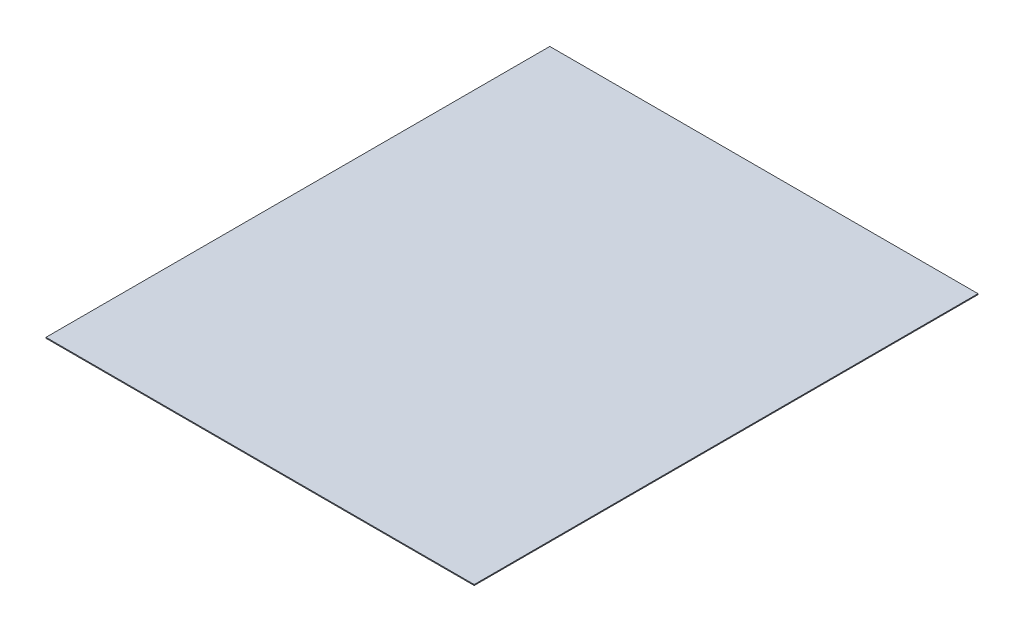
ISO-10303-21;
HEADER;
FILE_DESCRIPTION(('STEP AP214'),'2;1');
FILE_NAME('part.step','',(''),(''),'','','');
FILE_SCHEMA(('AUTOMOTIVE_DESIGN { 1 0 10303 214 1 1 1 1 }'));
ENDSEC;
DATA;
#1=APPLICATION_CONTEXT('core data for automotive mechanical design processes');
#2=APPLICATION_PROTOCOL_DEFINITION('international standard','automotive_design',2000,#1);
#3=PRODUCT_CONTEXT('',#1,'mechanical');
#4=PRODUCT('Part','Part','',(#3));
#5=PRODUCT_RELATED_PRODUCT_CATEGORY('part','',(#4));
#6=PRODUCT_DEFINITION_FORMATION('','',#4);
#7=PRODUCT_DEFINITION_CONTEXT('part definition',#1,'design');
#8=PRODUCT_DEFINITION('design','',#6,#7);
#9=PRODUCT_DEFINITION_SHAPE('','',#8);
#10=(LENGTH_UNIT() NAMED_UNIT(*) SI_UNIT(.MILLI.,.METRE.));
#11=(NAMED_UNIT(*) PLANE_ANGLE_UNIT() SI_UNIT($,.RADIAN.));
#12=(NAMED_UNIT(*) SI_UNIT($,.STERADIAN.) SOLID_ANGLE_UNIT());
#13=UNCERTAINTY_MEASURE_WITH_UNIT(LENGTH_MEASURE(1.E-05),#10,'distance_accuracy_value','');
#14=(GEOMETRIC_REPRESENTATION_CONTEXT(3) GLOBAL_UNCERTAINTY_ASSIGNED_CONTEXT((#13)) GLOBAL_UNIT_ASSIGNED_CONTEXT((#10,
#11,#12)) REPRESENTATION_CONTEXT('',''));
#15=CARTESIAN_POINT('',(0.,0.,0.));
#16=DIRECTION('',(0.,0.,1.));
#17=DIRECTION('',(1.,0.,0.));
#18=AXIS2_PLACEMENT_3D('',#15,#16,#17);
#19=CARTESIAN_POINT('',(1.5,1968.5,-820.));
#20=DIRECTION('',(-1.,0.,0.));
#21=DIRECTION('',(0.,0.,1.));
#22=AXIS2_PLACEMENT_3D('',#19,#20,#21);
#23=PLANE('',#22);
#24=DIRECTION('',(0.,-1.,0.));
#25=VECTOR('',#24,1.);
#26=CARTESIAN_POINT('',(1.5,1968.5,0.));
#27=LINE('',#26,#25);
#28=CARTESIAN_POINT('',(1.5,1970.,0.));
#29=VERTEX_POINT('',#28);
#30=CARTESIAN_POINT('',(1.5,1968.5,0.));
#31=VERTEX_POINT('',#30);
#32=EDGE_CURVE('E103',#29,#31,#27,.T.);
#33=ORIENTED_EDGE('',*,*,#32,.F.);
#34=DIRECTION('',(0.,0.,1.));
#35=VECTOR('',#34,1.);
#36=CARTESIAN_POINT('',(1.5,1970.,-820.));
#37=LINE('',#36,#35);
#38=CARTESIAN_POINT('',(1.5,1970.,-820.));
#39=VERTEX_POINT('',#38);
#40=EDGE_CURVE('E11',#39,#29,#37,.T.);
#41=ORIENTED_EDGE('',*,*,#40,.F.);
#42=DIRECTION('',(0.,-1.,0.));
#43=VECTOR('',#42,1.);
#44=CARTESIAN_POINT('',(1.5,1968.5,-820.));
#45=LINE('',#44,#43);
#46=CARTESIAN_POINT('',(1.5,1968.5,-820.));
#47=VERTEX_POINT('',#46);
#48=EDGE_CURVE('E97',#39,#47,#45,.T.);
#49=ORIENTED_EDGE('',*,*,#48,.T.);
#50=DIRECTION('',(0.,0.,1.));
#51=VECTOR('',#50,1.);
#52=CARTESIAN_POINT('',(1.5,1968.5,-820.));
#53=LINE('',#52,#51);
#54=EDGE_CURVE('E42',#47,#31,#53,.T.);
#55=ORIENTED_EDGE('',*,*,#54,.T.);
#56=EDGE_LOOP('',(#33,#41,#49,#55));
#57=FACE_BOUND('',#56,.T.);
#58=ADVANCED_FACE('F39',(#57),#23,.T.);
#59=CARTESIAN_POINT('',(1.5,1970.,-820.));
#60=DIRECTION('',(0.,1.,0.));
#61=DIRECTION('',(0.,0.,1.));
#62=AXIS2_PLACEMENT_3D('',#59,#60,#61);
#63=PLANE('',#62);
#64=DIRECTION('',(-1.,0.,0.));
#65=VECTOR('',#64,1.);
#66=CARTESIAN_POINT('',(1.5,1970.,0.));
#67=LINE('',#66,#65);
#68=CARTESIAN_POINT('',(698.5,1970.,0.));
#69=VERTEX_POINT('',#68);
#70=EDGE_CURVE('E99',#69,#29,#67,.T.);
#71=ORIENTED_EDGE('',*,*,#70,.F.);
#72=DIRECTION('',(0.,0.,1.));
#73=VECTOR('',#72,1.);
#74=CARTESIAN_POINT('',(698.5,1970.,-820.));
#75=LINE('',#74,#73);
#76=CARTESIAN_POINT('',(698.5,1970.,-820.));
#77=VERTEX_POINT('',#76);
#78=EDGE_CURVE('E48',#77,#69,#75,.T.);
#79=ORIENTED_EDGE('',*,*,#78,.F.);
#80=DIRECTION('',(-1.,0.,0.));
#81=VECTOR('',#80,1.);
#82=CARTESIAN_POINT('',(1.5,1970.,-820.));
#83=LINE('',#82,#81);
#84=EDGE_CURVE('E94',#77,#39,#83,.T.);
#85=ORIENTED_EDGE('',*,*,#84,.T.);
#86=ORIENTED_EDGE('',*,*,#40,.T.);
#87=EDGE_LOOP('',(#71,#79,#85,#86));
#88=FACE_BOUND('',#87,.T.);
#89=ADVANCED_FACE('F113',(#88),#63,.T.);
#90=CARTESIAN_POINT('',(698.5,1968.5,-820.));
#91=DIRECTION('',(1.,0.,0.));
#92=DIRECTION('',(0.,0.,-1.));
#93=AXIS2_PLACEMENT_3D('',#90,#91,#92);
#94=PLANE('',#93);
#95=DIRECTION('',(0.,1.,0.));
#96=VECTOR('',#95,1.);
#97=CARTESIAN_POINT('',(698.5,1968.5,0.));
#98=LINE('',#97,#96);
#99=CARTESIAN_POINT('',(698.5,1968.5,0.));
#100=VERTEX_POINT('',#99);
#101=EDGE_CURVE('E89',#100,#69,#98,.T.);
#102=ORIENTED_EDGE('',*,*,#101,.F.);
#103=DIRECTION('',(0.,0.,1.));
#104=VECTOR('',#103,1.);
#105=CARTESIAN_POINT('',(698.5,1968.5,-820.));
#106=LINE('',#105,#104);
#107=CARTESIAN_POINT('',(698.5,1968.5,-820.));
#108=VERTEX_POINT('',#107);
#109=EDGE_CURVE('E84',#108,#100,#106,.T.);
#110=ORIENTED_EDGE('',*,*,#109,.F.);
#111=DIRECTION('',(0.,1.,0.));
#112=VECTOR('',#111,1.);
#113=CARTESIAN_POINT('',(698.5,1968.5,-820.));
#114=LINE('',#113,#112);
#115=EDGE_CURVE('E87',#108,#77,#114,.T.);
#116=ORIENTED_EDGE('',*,*,#115,.T.);
#117=ORIENTED_EDGE('',*,*,#78,.T.);
#118=EDGE_LOOP('',(#102,#110,#116,#117));
#119=FACE_BOUND('',#118,.T.);
#120=ADVANCED_FACE('F86',(#119),#94,.T.);
#121=CARTESIAN_POINT('',(1.5,1968.5,-820.));
#122=DIRECTION('',(0.,-1.,0.));
#123=DIRECTION('',(0.,0.,-1.));
#124=AXIS2_PLACEMENT_3D('',#121,#122,#123);
#125=PLANE('',#124);
#126=DIRECTION('',(1.,0.,0.));
#127=VECTOR('',#126,1.);
#128=CARTESIAN_POINT('',(1.5,1968.5,0.));
#129=LINE('',#128,#127);
#130=EDGE_CURVE('E106',#31,#100,#129,.T.);
#131=ORIENTED_EDGE('',*,*,#130,.F.);
#132=ORIENTED_EDGE('',*,*,#54,.F.);
#133=DIRECTION('',(1.,0.,0.));
#134=VECTOR('',#133,1.);
#135=CARTESIAN_POINT('',(1.5,1968.5,-820.));
#136=LINE('',#135,#134);
#137=EDGE_CURVE('E93',#47,#108,#136,.T.);
#138=ORIENTED_EDGE('',*,*,#137,.T.);
#139=ORIENTED_EDGE('',*,*,#109,.T.);
#140=EDGE_LOOP('',(#131,#132,#138,#139));
#141=FACE_BOUND('',#140,.T.);
#142=ADVANCED_FACE('F96',(#141),#125,.T.);
#143=CARTESIAN_POINT('',(0.,0.,-820.));
#144=DIRECTION('',(0.,0.,-1.));
#145=DIRECTION('',(-1.,0.,0.));
#146=AXIS2_PLACEMENT_3D('',#143,#144,#145);
#147=PLANE('',#146);
#148=ORIENTED_EDGE('',*,*,#48,.F.);
#149=ORIENTED_EDGE('',*,*,#84,.F.);
#150=ORIENTED_EDGE('',*,*,#115,.F.);
#151=ORIENTED_EDGE('',*,*,#137,.F.);
#152=EDGE_LOOP('',(#148,#149,#150,#151));
#153=FACE_BOUND('',#152,.T.);
#154=ADVANCED_FACE('F92',(#153),#147,.T.);
#155=CARTESIAN_POINT('',(0.,0.,0.));
#156=DIRECTION('',(0.,0.,-1.));
#157=DIRECTION('',(-1.,0.,0.));
#158=AXIS2_PLACEMENT_3D('',#155,#156,#157);
#159=PLANE('',#158);
#160=ORIENTED_EDGE('',*,*,#32,.T.);
#161=ORIENTED_EDGE('',*,*,#130,.T.);
#162=ORIENTED_EDGE('',*,*,#101,.T.);
#163=ORIENTED_EDGE('',*,*,#70,.T.);
#164=EDGE_LOOP('',(#160,#161,#162,#163));
#165=FACE_BOUND('',#164,.T.);
#166=ADVANCED_FACE('F112',(#165),#159,.F.);
#167=CLOSED_SHELL('',(#58,#89,#120,#142,#154,#166));
#168=MANIFOLD_SOLID_BREP('B2',#167);
#169=ADVANCED_BREP_SHAPE_REPRESENTATION('',(#18,#168),#14);
#170=SHAPE_DEFINITION_REPRESENTATION(#9,#169);
ENDSEC;
END-ISO-10303-21;
